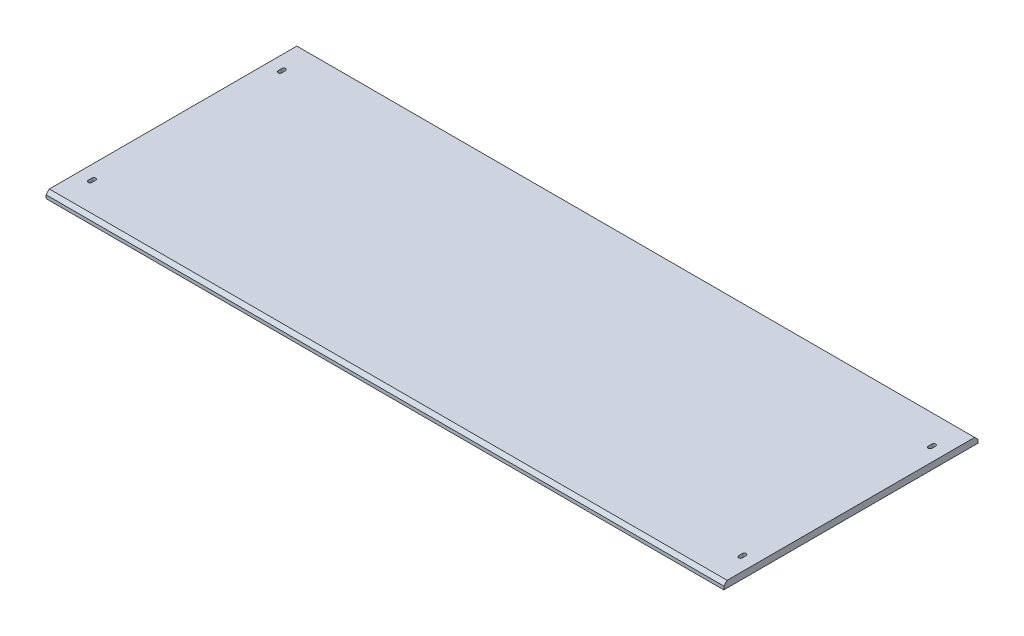
ISO-10303-21;
HEADER;
FILE_DESCRIPTION(('STEP AP214'),'2;1');
FILE_NAME('part.step','',(''),(''),'','','');
FILE_SCHEMA(('AUTOMOTIVE_DESIGN { 1 0 10303 214 1 1 1 1 }'));
ENDSEC;
DATA;
#1=APPLICATION_CONTEXT('core data for automotive mechanical design processes');
#2=APPLICATION_PROTOCOL_DEFINITION('international standard','automotive_design',2000,#1);
#3=PRODUCT_CONTEXT('',#1,'mechanical');
#4=PRODUCT('Part','Part','',(#3));
#5=PRODUCT_RELATED_PRODUCT_CATEGORY('part','',(#4));
#6=PRODUCT_DEFINITION_FORMATION('','',#4);
#7=PRODUCT_DEFINITION_CONTEXT('part definition',#1,'design');
#8=PRODUCT_DEFINITION('design','',#6,#7);
#9=PRODUCT_DEFINITION_SHAPE('','',#8);
#10=(LENGTH_UNIT() NAMED_UNIT(*) SI_UNIT(.MILLI.,.METRE.));
#11=(NAMED_UNIT(*) PLANE_ANGLE_UNIT() SI_UNIT($,.RADIAN.));
#12=(NAMED_UNIT(*) SI_UNIT($,.STERADIAN.) SOLID_ANGLE_UNIT());
#13=UNCERTAINTY_MEASURE_WITH_UNIT(LENGTH_MEASURE(1.E-05),#10,'distance_accuracy_value','');
#14=(GEOMETRIC_REPRESENTATION_CONTEXT(3) GLOBAL_UNCERTAINTY_ASSIGNED_CONTEXT((#13)) GLOBAL_UNIT_ASSIGNED_CONTEXT((#10,
#11,#12)) REPRESENTATION_CONTEXT('',''));
#15=CARTESIAN_POINT('',(0.,0.,0.));
#16=DIRECTION('',(0.,0.,1.));
#17=DIRECTION('',(1.,0.,0.));
#18=AXIS2_PLACEMENT_3D('',#15,#16,#17);
#19=CARTESIAN_POINT('',(0.,12.,222.6));
#20=DIRECTION('',(0.,-0.707106781186548,-0.707106781186548));
#21=DIRECTION('',(0.,0.707106781186548,-0.707106781186548));
#22=AXIS2_PLACEMENT_3D('',#19,#20,#21);
#23=PLANE('',#22);
#24=DIRECTION('',(-1.,0.,0.));
#25=VECTOR('',#24,1.);
#26=CARTESIAN_POINT('',(-609.6,5.99999999999999,228.6));
#27=LINE('',#26,#25);
#28=CARTESIAN_POINT('',(-609.6,5.99999999999999,228.6));
#29=VERTEX_POINT('',#28);
#30=CARTESIAN_POINT('',(609.6,5.99999999999999,228.6));
#31=VERTEX_POINT('',#30);
#32=EDGE_CURVE('E299',#29,#31,#27,.F.);
#33=ORIENTED_EDGE('',*,*,#32,.T.);
#34=DIRECTION('',(0.,0.707106781186546,-0.707106781186549));
#35=VECTOR('',#34,1.);
#36=CARTESIAN_POINT('',(609.6,5.99999999999999,228.6));
#37=LINE('',#36,#35);
#38=CARTESIAN_POINT('',(609.6,12.,222.6));
#39=VERTEX_POINT('',#38);
#40=EDGE_CURVE('E197',#31,#39,#37,.T.);
#41=ORIENTED_EDGE('',*,*,#40,.T.);
#42=DIRECTION('',(1.,0.,0.));
#43=VECTOR('',#42,1.);
#44=CARTESIAN_POINT('',(0.,12.,222.6));
#45=LINE('',#44,#43);
#46=CARTESIAN_POINT('',(-609.6,12.,222.6));
#47=VERTEX_POINT('',#46);
#48=EDGE_CURVE('E192',#39,#47,#45,.F.);
#49=ORIENTED_EDGE('',*,*,#48,.T.);
#50=DIRECTION('',(0.,-0.707106781186546,0.707106781186549));
#51=VECTOR('',#50,1.);
#52=CARTESIAN_POINT('',(-609.6,12.,222.6));
#53=LINE('',#52,#51);
#54=EDGE_CURVE('E295',#47,#29,#53,.T.);
#55=ORIENTED_EDGE('',*,*,#54,.T.);
#56=EDGE_LOOP('',(#33,#41,#49,#55));
#57=FACE_BOUND('',#56,.T.);
#58=ADVANCED_FACE('F17',(#57),#23,.F.);
#59=CARTESIAN_POINT('',(0.,12.,0.));
#60=DIRECTION('',(0.,-1.,0.));
#61=DIRECTION('',(0.,0.,-1.));
#62=AXIS2_PLACEMENT_3D('',#59,#60,#61);
#63=PLANE('',#62);
#64=DIRECTION('',(1.,0.,0.));
#65=VECTOR('',#64,1.);
#66=CARTESIAN_POINT('',(0.,12.,-222.6));
#67=LINE('',#66,#65);
#68=CARTESIAN_POINT('',(609.6,12.,-222.6));
#69=VERTEX_POINT('',#68);
#70=CARTESIAN_POINT('',(-609.6,12.,-222.6));
#71=VERTEX_POINT('',#70);
#72=EDGE_CURVE('E174',#69,#71,#67,.F.);
#73=ORIENTED_EDGE('',*,*,#72,.T.);
#74=DIRECTION('',(0.,0.,-1.));
#75=VECTOR('',#74,1.);
#76=CARTESIAN_POINT('',(-609.6,12.,228.6));
#77=LINE('',#76,#75);
#78=EDGE_CURVE('E287',#71,#47,#77,.F.);
#79=ORIENTED_EDGE('',*,*,#78,.T.);
#80=ORIENTED_EDGE('',*,*,#48,.F.);
#81=DIRECTION('',(0.,0.,1.));
#82=VECTOR('',#81,1.);
#83=CARTESIAN_POINT('',(609.6,12.,228.6));
#84=LINE('',#83,#82);
#85=EDGE_CURVE('E303',#39,#69,#84,.F.);
#86=ORIENTED_EDGE('',*,*,#85,.T.);
#87=EDGE_LOOP('',(#73,#79,#80,#86));
#88=FACE_BOUND('',#87,.T.);
#89=CARTESIAN_POINT('',(-584.835,12.,-173.99519258972));
#90=DIRECTION('',(0.,1.,0.));
#91=DIRECTION('',(0.,0.,1.));
#92=AXIS2_PLACEMENT_3D('',#89,#90,#91);
#93=CIRCLE('',#92,3.36550000000024);
#94=CARTESIAN_POINT('',(-588.200500000001,12.,-173.99519258972));
#95=VERTEX_POINT('',#94);
#96=CARTESIAN_POINT('',(-581.4695,12.,-173.99519258972));
#97=VERTEX_POINT('',#96);
#98=EDGE_CURVE('E207',#95,#97,#93,.F.);
#99=ORIENTED_EDGE('',*,*,#98,.T.);
#100=DIRECTION('',(0.,0.,-1.));
#101=VECTOR('',#100,1.);
#102=CARTESIAN_POINT('',(-581.4695,12.,-173.99519258972));
#103=LINE('',#102,#101);
#104=CARTESIAN_POINT('',(-581.4695,12.,-167.26419258972));
#105=VERTEX_POINT('',#104);
#106=EDGE_CURVE('E194',#97,#105,#103,.F.);
#107=ORIENTED_EDGE('',*,*,#106,.T.);
#108=CARTESIAN_POINT('',(-584.835,12.,-167.26419258972));
#109=DIRECTION('',(0.,1.,0.));
#110=DIRECTION('',(0.,0.,1.));
#111=AXIS2_PLACEMENT_3D('',#108,#109,#110);
#112=CIRCLE('',#111,3.36550000000024);
#113=CARTESIAN_POINT('',(-588.200500000001,12.,-167.26419258972));
#114=VERTEX_POINT('',#113);
#115=EDGE_CURVE('E253',#105,#114,#112,.F.);
#116=ORIENTED_EDGE('',*,*,#115,.T.);
#117=DIRECTION('',(0.,0.,1.));
#118=VECTOR('',#117,1.);
#119=CARTESIAN_POINT('',(-588.200500000001,12.,-173.99519258972));
#120=LINE('',#119,#118);
#121=EDGE_CURVE('E199',#114,#95,#120,.F.);
#122=ORIENTED_EDGE('',*,*,#121,.T.);
#123=EDGE_LOOP('',(#99,#107,#116,#122));
#124=FACE_BOUND('',#123,.T.);
#125=CARTESIAN_POINT('',(-584.835,12.,173.99519258972));
#126=DIRECTION('',(0.,1.,0.));
#127=DIRECTION('',(0.,0.,1.));
#128=AXIS2_PLACEMENT_3D('',#125,#126,#127);
#129=CIRCLE('',#128,3.36550000000002);
#130=CARTESIAN_POINT('',(-581.4695,12.,173.99519258972));
#131=VERTEX_POINT('',#130);
#132=CARTESIAN_POINT('',(-588.2005,12.,173.99519258972));
#133=VERTEX_POINT('',#132);
#134=EDGE_CURVE('E217',#131,#133,#129,.F.);
#135=ORIENTED_EDGE('',*,*,#134,.T.);
#136=DIRECTION('',(0.,0.,1.));
#137=VECTOR('',#136,1.);
#138=CARTESIAN_POINT('',(-588.2005,12.,173.99519258972));
#139=LINE('',#138,#137);
#140=CARTESIAN_POINT('',(-588.2005,12.,167.26419258972));
#141=VERTEX_POINT('',#140);
#142=EDGE_CURVE('E204',#133,#141,#139,.F.);
#143=ORIENTED_EDGE('',*,*,#142,.T.);
#144=CARTESIAN_POINT('',(-584.835,12.,167.26419258972));
#145=DIRECTION('',(0.,1.,0.));
#146=DIRECTION('',(0.,0.,1.));
#147=AXIS2_PLACEMENT_3D('',#144,#145,#146);
#148=CIRCLE('',#147,3.36550000000002);
#149=CARTESIAN_POINT('',(-581.4695,12.,167.26419258972));
#150=VERTEX_POINT('',#149);
#151=EDGE_CURVE('E257',#141,#150,#148,.F.);
#152=ORIENTED_EDGE('',*,*,#151,.T.);
#153=DIRECTION('',(0.,0.,-1.));
#154=VECTOR('',#153,1.);
#155=CARTESIAN_POINT('',(-581.4695,12.,173.99519258972));
#156=LINE('',#155,#154);
#157=EDGE_CURVE('E209',#150,#131,#156,.F.);
#158=ORIENTED_EDGE('',*,*,#157,.T.);
#159=EDGE_LOOP('',(#135,#143,#152,#158));
#160=FACE_BOUND('',#159,.T.);
#161=CARTESIAN_POINT('',(584.835,12.,173.99519258972));
#162=DIRECTION('',(0.,1.,0.));
#163=DIRECTION('',(0.,0.,1.));
#164=AXIS2_PLACEMENT_3D('',#161,#162,#163);
#165=CIRCLE('',#164,3.36550000000002);
#166=CARTESIAN_POINT('',(588.2005,12.,173.99519258972));
#167=VERTEX_POINT('',#166);
#168=CARTESIAN_POINT('',(581.4695,12.,173.99519258972));
#169=VERTEX_POINT('',#168);
#170=EDGE_CURVE('E225',#167,#169,#165,.F.);
#171=ORIENTED_EDGE('',*,*,#170,.T.);
#172=DIRECTION('',(0.,0.,1.));
#173=VECTOR('',#172,1.);
#174=CARTESIAN_POINT('',(581.4695,12.,173.99519258972));
#175=LINE('',#174,#173);
#176=CARTESIAN_POINT('',(581.4695,12.,167.26419258972));
#177=VERTEX_POINT('',#176);
#178=EDGE_CURVE('E214',#169,#177,#175,.F.);
#179=ORIENTED_EDGE('',*,*,#178,.T.);
#180=CARTESIAN_POINT('',(584.835,12.,167.26419258972));
#181=DIRECTION('',(0.,1.,0.));
#182=DIRECTION('',(0.,0.,1.));
#183=AXIS2_PLACEMENT_3D('',#180,#181,#182);
#184=CIRCLE('',#183,3.36550000000002);
#185=CARTESIAN_POINT('',(588.2005,12.,167.26419258972));
#186=VERTEX_POINT('',#185);
#187=EDGE_CURVE('E262',#177,#186,#184,.F.);
#188=ORIENTED_EDGE('',*,*,#187,.T.);
#189=DIRECTION('',(0.,0.,-1.));
#190=VECTOR('',#189,1.);
#191=CARTESIAN_POINT('',(588.2005,12.,173.99519258972));
#192=LINE('',#191,#190);
#193=EDGE_CURVE('E219',#186,#167,#192,.F.);
#194=ORIENTED_EDGE('',*,*,#193,.T.);
#195=EDGE_LOOP('',(#171,#179,#188,#194));
#196=FACE_BOUND('',#195,.T.);
#197=CARTESIAN_POINT('',(584.835,12.,-173.99519258972));
#198=DIRECTION('',(0.,1.,0.));
#199=DIRECTION('',(0.,0.,1.));
#200=AXIS2_PLACEMENT_3D('',#197,#198,#199);
#201=CIRCLE('',#200,3.36550000000002);
#202=CARTESIAN_POINT('',(581.4695,12.,-173.99519258972));
#203=VERTEX_POINT('',#202);
#204=CARTESIAN_POINT('',(588.2005,12.,-173.99519258972));
#205=VERTEX_POINT('',#204);
#206=EDGE_CURVE('E20',#203,#205,#201,.F.);
#207=ORIENTED_EDGE('',*,*,#206,.T.);
#208=DIRECTION('',(0.,0.,-1.));
#209=VECTOR('',#208,1.);
#210=CARTESIAN_POINT('',(588.2005,12.,-173.99519258972));
#211=LINE('',#210,#209);
#212=CARTESIAN_POINT('',(588.2005,12.,-167.26419258972));
#213=VERTEX_POINT('',#212);
#214=EDGE_CURVE('E224',#205,#213,#211,.F.);
#215=ORIENTED_EDGE('',*,*,#214,.T.);
#216=CARTESIAN_POINT('',(584.835,12.,-167.26419258972));
#217=DIRECTION('',(0.,1.,0.));
#218=DIRECTION('',(0.,0.,1.));
#219=AXIS2_PLACEMENT_3D('',#216,#217,#218);
#220=CIRCLE('',#219,3.36550000000002);
#221=CARTESIAN_POINT('',(581.4695,12.,-167.26419258972));
#222=VERTEX_POINT('',#221);
#223=EDGE_CURVE('E178',#213,#222,#220,.F.);
#224=ORIENTED_EDGE('',*,*,#223,.T.);
#225=DIRECTION('',(0.,0.,1.));
#226=VECTOR('',#225,1.);
#227=CARTESIAN_POINT('',(581.4695,12.,-173.99519258972));
#228=LINE('',#227,#226);
#229=EDGE_CURVE('E176',#222,#203,#228,.F.);
#230=ORIENTED_EDGE('',*,*,#229,.T.);
#231=EDGE_LOOP('',(#207,#215,#224,#230));
#232=FACE_BOUND('',#231,.T.);
#233=ADVANCED_FACE('F177',(#88,#124,#160,#196,#232),#63,.F.);
#234=CARTESIAN_POINT('',(0.,12.,-222.6));
#235=DIRECTION('',(0.,-0.707106781186548,0.707106781186548));
#236=DIRECTION('',(0.,-0.707106781186548,-0.707106781186548));
#237=AXIS2_PLACEMENT_3D('',#234,#235,#236);
#238=PLANE('',#237);
#239=DIRECTION('',(1.,0.,0.));
#240=VECTOR('',#239,1.);
#241=CARTESIAN_POINT('',(-609.6,6.00000000000011,-228.6));
#242=LINE('',#241,#240);
#243=CARTESIAN_POINT('',(609.6,6.00000000000011,-228.6));
#244=VERTEX_POINT('',#243);
#245=CARTESIAN_POINT('',(-609.6,6.00000000000012,-228.6));
#246=VERTEX_POINT('',#245);
#247=EDGE_CURVE('E282',#244,#246,#242,.F.);
#248=ORIENTED_EDGE('',*,*,#247,.T.);
#249=DIRECTION('',(0.,0.707106781186554,0.707106781186541));
#250=VECTOR('',#249,1.);
#251=CARTESIAN_POINT('',(-609.6,6.00000000000011,-228.6));
#252=LINE('',#251,#250);
#253=EDGE_CURVE('E290',#246,#71,#252,.T.);
#254=ORIENTED_EDGE('',*,*,#253,.T.);
#255=ORIENTED_EDGE('',*,*,#72,.F.);
#256=DIRECTION('',(0.,-0.707106781186554,-0.707106781186541));
#257=VECTOR('',#256,1.);
#258=CARTESIAN_POINT('',(609.6,12.,-222.6));
#259=LINE('',#258,#257);
#260=EDGE_CURVE('E301',#69,#244,#259,.T.);
#261=ORIENTED_EDGE('',*,*,#260,.T.);
#262=EDGE_LOOP('',(#248,#254,#255,#261));
#263=FACE_BOUND('',#262,.T.);
#264=ADVANCED_FACE('F374',(#263),#238,.F.);
#265=CARTESIAN_POINT('',(584.835,0.,-173.99519258972));
#266=DIRECTION('',(0.,1.,0.));
#267=DIRECTION('',(0.,0.,1.));
#268=AXIS2_PLACEMENT_3D('',#265,#266,#267);
#269=CYLINDRICAL_SURFACE('',#268,3.36550000000002);
#270=DIRECTION('',(0.,1.,0.));
#271=VECTOR('',#270,1.);
#272=CARTESIAN_POINT('',(581.4695,0.,-173.99519258972));
#273=LINE('',#272,#271);
#274=CARTESIAN_POINT('',(581.4695,0.,-173.99519258972));
#275=VERTEX_POINT('',#274);
#276=EDGE_CURVE('E167',#203,#275,#273,.F.);
#277=ORIENTED_EDGE('',*,*,#276,.T.);
#278=CARTESIAN_POINT('',(584.835,0.,-173.99519258972));
#279=DIRECTION('',(0.,1.,0.));
#280=DIRECTION('',(0.,0.,1.));
#281=AXIS2_PLACEMENT_3D('',#278,#279,#280);
#282=CIRCLE('',#281,3.36550000000002);
#283=CARTESIAN_POINT('',(588.2005,0.,-173.99519258972));
#284=VERTEX_POINT('',#283);
#285=EDGE_CURVE('E251',#284,#275,#282,.T.);
#286=ORIENTED_EDGE('',*,*,#285,.F.);
#287=DIRECTION('',(0.,1.,0.));
#288=VECTOR('',#287,1.);
#289=CARTESIAN_POINT('',(588.2005,0.,-173.99519258972));
#290=LINE('',#289,#288);
#291=EDGE_CURVE('E170',#284,#205,#290,.T.);
#292=ORIENTED_EDGE('',*,*,#291,.T.);
#293=ORIENTED_EDGE('',*,*,#206,.F.);
#294=EDGE_LOOP('',(#277,#286,#292,#293));
#295=FACE_BOUND('',#294,.T.);
#296=ADVANCED_FACE('F165',(#295),#269,.F.);
#297=CARTESIAN_POINT('',(581.4695,0.,-173.99519258972));
#298=DIRECTION('',(-1.,0.,0.));
#299=DIRECTION('',(0.,0.,1.));
#300=AXIS2_PLACEMENT_3D('',#297,#298,#299);
#301=PLANE('',#300);
#302=DIRECTION('',(0.,1.,0.));
#303=VECTOR('',#302,1.);
#304=CARTESIAN_POINT('',(581.4695,0.,-167.26419258972));
#305=LINE('',#304,#303);
#306=CARTESIAN_POINT('',(581.4695,0.,-167.26419258972));
#307=VERTEX_POINT('',#306);
#308=EDGE_CURVE('E181',#222,#307,#305,.F.);
#309=ORIENTED_EDGE('',*,*,#308,.T.);
#310=DIRECTION('',(0.,0.,-1.));
#311=VECTOR('',#310,1.);
#312=CARTESIAN_POINT('',(581.4695,0.,0.));
#313=LINE('',#312,#311);
#314=EDGE_CURVE('E185',#275,#307,#313,.F.);
#315=ORIENTED_EDGE('',*,*,#314,.F.);
#316=ORIENTED_EDGE('',*,*,#276,.F.);
#317=ORIENTED_EDGE('',*,*,#229,.F.);
#318=EDGE_LOOP('',(#309,#315,#316,#317));
#319=FACE_BOUND('',#318,.T.);
#320=ADVANCED_FACE('F183',(#319),#301,.F.);
#321=CARTESIAN_POINT('',(584.835,0.,-167.26419258972));
#322=DIRECTION('',(0.,1.,0.));
#323=DIRECTION('',(0.,0.,1.));
#324=AXIS2_PLACEMENT_3D('',#321,#322,#323);
#325=CYLINDRICAL_SURFACE('',#324,3.36550000000002);
#326=DIRECTION('',(0.,1.,0.));
#327=VECTOR('',#326,1.);
#328=CARTESIAN_POINT('',(588.2005,0.,-167.26419258972));
#329=LINE('',#328,#327);
#330=CARTESIAN_POINT('',(588.2005,0.,-167.26419258972));
#331=VERTEX_POINT('',#330);
#332=EDGE_CURVE('E266',#213,#331,#329,.F.);
#333=ORIENTED_EDGE('',*,*,#332,.T.);
#334=CARTESIAN_POINT('',(584.835,0.,-167.26419258972));
#335=DIRECTION('',(0.,1.,0.));
#336=DIRECTION('',(0.,0.,1.));
#337=AXIS2_PLACEMENT_3D('',#334,#335,#336);
#338=CIRCLE('',#337,3.36550000000002);
#339=EDGE_CURVE('E249',#307,#331,#338,.T.);
#340=ORIENTED_EDGE('',*,*,#339,.F.);
#341=ORIENTED_EDGE('',*,*,#308,.F.);
#342=ORIENTED_EDGE('',*,*,#223,.F.);
#343=EDGE_LOOP('',(#333,#340,#341,#342));
#344=FACE_BOUND('',#343,.T.);
#345=ADVANCED_FACE('F271',(#344),#325,.F.);
#346=CARTESIAN_POINT('',(588.2005,0.,-173.99519258972));
#347=DIRECTION('',(1.,0.,0.));
#348=DIRECTION('',(0.,0.,-1.));
#349=AXIS2_PLACEMENT_3D('',#346,#347,#348);
#350=PLANE('',#349);
#351=ORIENTED_EDGE('',*,*,#291,.F.);
#352=DIRECTION('',(0.,0.,-1.));
#353=VECTOR('',#352,1.);
#354=CARTESIAN_POINT('',(588.2005,0.,0.));
#355=LINE('',#354,#353);
#356=EDGE_CURVE('E248',#331,#284,#355,.T.);
#357=ORIENTED_EDGE('',*,*,#356,.F.);
#358=ORIENTED_EDGE('',*,*,#332,.F.);
#359=ORIENTED_EDGE('',*,*,#214,.F.);
#360=EDGE_LOOP('',(#351,#357,#358,#359));
#361=FACE_BOUND('',#360,.T.);
#362=ADVANCED_FACE('F437',(#361),#350,.F.);
#363=CARTESIAN_POINT('',(584.835,0.,173.99519258972));
#364=DIRECTION('',(0.,1.,0.));
#365=DIRECTION('',(0.,0.,1.));
#366=AXIS2_PLACEMENT_3D('',#363,#364,#365);
#367=CYLINDRICAL_SURFACE('',#366,3.36550000000002);
#368=DIRECTION('',(0.,1.,0.));
#369=VECTOR('',#368,1.);
#370=CARTESIAN_POINT('',(588.2005,0.,173.99519258972));
#371=LINE('',#370,#369);
#372=CARTESIAN_POINT('',(588.2005,0.,173.99519258972));
#373=VERTEX_POINT('',#372);
#374=EDGE_CURVE('E223',#167,#373,#371,.F.);
#375=ORIENTED_EDGE('',*,*,#374,.T.);
#376=CARTESIAN_POINT('',(584.835,0.,173.99519258972));
#377=DIRECTION('',(0.,1.,0.));
#378=DIRECTION('',(0.,0.,1.));
#379=AXIS2_PLACEMENT_3D('',#376,#377,#378);
#380=CIRCLE('',#379,3.36550000000002);
#381=CARTESIAN_POINT('',(581.4695,0.,173.99519258972));
#382=VERTEX_POINT('',#381);
#383=EDGE_CURVE('E246',#382,#373,#380,.T.);
#384=ORIENTED_EDGE('',*,*,#383,.F.);
#385=DIRECTION('',(0.,1.,0.));
#386=VECTOR('',#385,1.);
#387=CARTESIAN_POINT('',(581.4695,0.,173.99519258972));
#388=LINE('',#387,#386);
#389=EDGE_CURVE('E218',#382,#169,#388,.T.);
#390=ORIENTED_EDGE('',*,*,#389,.T.);
#391=ORIENTED_EDGE('',*,*,#170,.F.);
#392=EDGE_LOOP('',(#375,#384,#390,#391));
#393=FACE_BOUND('',#392,.T.);
#394=ADVANCED_FACE('F326',(#393),#367,.F.);
#395=CARTESIAN_POINT('',(588.2005,0.,173.99519258972));
#396=DIRECTION('',(1.,0.,0.));
#397=DIRECTION('',(0.,0.,-1.));
#398=AXIS2_PLACEMENT_3D('',#395,#396,#397);
#399=PLANE('',#398);
#400=DIRECTION('',(0.,1.,0.));
#401=VECTOR('',#400,1.);
#402=CARTESIAN_POINT('',(588.2005,0.,167.26419258972));
#403=LINE('',#402,#401);
#404=CARTESIAN_POINT('',(588.2005,0.,167.26419258972));
#405=VERTEX_POINT('',#404);
#406=EDGE_CURVE('E222',#186,#405,#403,.F.);
#407=ORIENTED_EDGE('',*,*,#406,.T.);
#408=DIRECTION('',(0.,0.,-1.));
#409=VECTOR('',#408,1.);
#410=CARTESIAN_POINT('',(588.2005,0.,0.));
#411=LINE('',#410,#409);
#412=EDGE_CURVE('E245',#373,#405,#411,.T.);
#413=ORIENTED_EDGE('',*,*,#412,.F.);
#414=ORIENTED_EDGE('',*,*,#374,.F.);
#415=ORIENTED_EDGE('',*,*,#193,.F.);
#416=EDGE_LOOP('',(#407,#413,#414,#415));
#417=FACE_BOUND('',#416,.T.);
#418=ADVANCED_FACE('F330',(#417),#399,.F.);
#419=CARTESIAN_POINT('',(584.835,0.,167.26419258972));
#420=DIRECTION('',(0.,1.,0.));
#421=DIRECTION('',(0.,0.,1.));
#422=AXIS2_PLACEMENT_3D('',#419,#420,#421);
#423=CYLINDRICAL_SURFACE('',#422,3.36550000000002);
#424=DIRECTION('',(0.,1.,0.));
#425=VECTOR('',#424,1.);
#426=CARTESIAN_POINT('',(581.4695,0.,167.26419258972));
#427=LINE('',#426,#425);
#428=CARTESIAN_POINT('',(581.4695,0.,167.26419258972));
#429=VERTEX_POINT('',#428);
#430=EDGE_CURVE('E265',#177,#429,#427,.F.);
#431=ORIENTED_EDGE('',*,*,#430,.T.);
#432=CARTESIAN_POINT('',(584.835,0.,167.26419258972));
#433=DIRECTION('',(0.,1.,0.));
#434=DIRECTION('',(0.,0.,1.));
#435=AXIS2_PLACEMENT_3D('',#432,#433,#434);
#436=CIRCLE('',#435,3.36550000000002);
#437=EDGE_CURVE('E242',#405,#429,#436,.T.);
#438=ORIENTED_EDGE('',*,*,#437,.F.);
#439=ORIENTED_EDGE('',*,*,#406,.F.);
#440=ORIENTED_EDGE('',*,*,#187,.F.);
#441=EDGE_LOOP('',(#431,#438,#439,#440));
#442=FACE_BOUND('',#441,.T.);
#443=ADVANCED_FACE('F428',(#442),#423,.F.);
#444=CARTESIAN_POINT('',(581.4695,0.,173.99519258972));
#445=DIRECTION('',(-1.,0.,0.));
#446=DIRECTION('',(0.,0.,1.));
#447=AXIS2_PLACEMENT_3D('',#444,#445,#446);
#448=PLANE('',#447);
#449=ORIENTED_EDGE('',*,*,#389,.F.);
#450=DIRECTION('',(0.,0.,-1.));
#451=VECTOR('',#450,1.);
#452=CARTESIAN_POINT('',(581.4695,0.,0.));
#453=LINE('',#452,#451);
#454=EDGE_CURVE('E241',#429,#382,#453,.F.);
#455=ORIENTED_EDGE('',*,*,#454,.F.);
#456=ORIENTED_EDGE('',*,*,#430,.F.);
#457=ORIENTED_EDGE('',*,*,#178,.F.);
#458=EDGE_LOOP('',(#449,#455,#456,#457));
#459=FACE_BOUND('',#458,.T.);
#460=ADVANCED_FACE('F424',(#459),#448,.F.);
#461=CARTESIAN_POINT('',(-584.835,0.,173.99519258972));
#462=DIRECTION('',(0.,1.,0.));
#463=DIRECTION('',(0.,0.,1.));
#464=AXIS2_PLACEMENT_3D('',#461,#462,#463);
#465=CYLINDRICAL_SURFACE('',#464,3.36550000000002);
#466=DIRECTION('',(0.,1.,0.));
#467=VECTOR('',#466,1.);
#468=CARTESIAN_POINT('',(-581.4695,0.,173.99519258972));
#469=LINE('',#468,#467);
#470=CARTESIAN_POINT('',(-581.4695,0.,173.99519258972));
#471=VERTEX_POINT('',#470);
#472=EDGE_CURVE('E213',#131,#471,#469,.F.);
#473=ORIENTED_EDGE('',*,*,#472,.T.);
#474=CARTESIAN_POINT('',(-584.835,0.,173.99519258972));
#475=DIRECTION('',(0.,1.,0.));
#476=DIRECTION('',(0.,0.,1.));
#477=AXIS2_PLACEMENT_3D('',#474,#475,#476);
#478=CIRCLE('',#477,3.36550000000002);
#479=CARTESIAN_POINT('',(-588.2005,0.,173.99519258972));
#480=VERTEX_POINT('',#479);
#481=EDGE_CURVE('E239',#480,#471,#478,.T.);
#482=ORIENTED_EDGE('',*,*,#481,.F.);
#483=DIRECTION('',(0.,1.,0.));
#484=VECTOR('',#483,1.);
#485=CARTESIAN_POINT('',(-588.2005,0.,173.99519258972));
#486=LINE('',#485,#484);
#487=EDGE_CURVE('E208',#480,#133,#486,.T.);
#488=ORIENTED_EDGE('',*,*,#487,.T.);
#489=ORIENTED_EDGE('',*,*,#134,.F.);
#490=EDGE_LOOP('',(#473,#482,#488,#489));
#491=FACE_BOUND('',#490,.T.);
#492=ADVANCED_FACE('F420',(#491),#465,.F.);
#493=CARTESIAN_POINT('',(-581.4695,0.,173.99519258972));
#494=DIRECTION('',(1.,0.,0.));
#495=DIRECTION('',(0.,0.,-1.));
#496=AXIS2_PLACEMENT_3D('',#493,#494,#495);
#497=PLANE('',#496);
#498=DIRECTION('',(0.,1.,0.));
#499=VECTOR('',#498,1.);
#500=CARTESIAN_POINT('',(-581.4695,0.,167.26419258972));
#501=LINE('',#500,#499);
#502=CARTESIAN_POINT('',(-581.4695,0.,167.26419258972));
#503=VERTEX_POINT('',#502);
#504=EDGE_CURVE('E212',#150,#503,#501,.F.);
#505=ORIENTED_EDGE('',*,*,#504,.T.);
#506=DIRECTION('',(0.,0.,-1.));
#507=VECTOR('',#506,1.);
#508=CARTESIAN_POINT('',(-581.4695,0.,0.));
#509=LINE('',#508,#507);
#510=EDGE_CURVE('E238',#471,#503,#509,.T.);
#511=ORIENTED_EDGE('',*,*,#510,.F.);
#512=ORIENTED_EDGE('',*,*,#472,.F.);
#513=ORIENTED_EDGE('',*,*,#157,.F.);
#514=EDGE_LOOP('',(#505,#511,#512,#513));
#515=FACE_BOUND('',#514,.T.);
#516=ADVANCED_FACE('F416',(#515),#497,.F.);
#517=CARTESIAN_POINT('',(-584.835,0.,167.26419258972));
#518=DIRECTION('',(0.,1.,0.));
#519=DIRECTION('',(0.,0.,1.));
#520=AXIS2_PLACEMENT_3D('',#517,#518,#519);
#521=CYLINDRICAL_SURFACE('',#520,3.36550000000002);
#522=DIRECTION('',(0.,1.,0.));
#523=VECTOR('',#522,1.);
#524=CARTESIAN_POINT('',(-588.2005,0.,167.26419258972));
#525=LINE('',#524,#523);
#526=CARTESIAN_POINT('',(-588.2005,0.,167.26419258972));
#527=VERTEX_POINT('',#526);
#528=EDGE_CURVE('E260',#141,#527,#525,.F.);
#529=ORIENTED_EDGE('',*,*,#528,.T.);
#530=CARTESIAN_POINT('',(-584.835,0.,167.26419258972));
#531=DIRECTION('',(0.,1.,0.));
#532=DIRECTION('',(0.,0.,1.));
#533=AXIS2_PLACEMENT_3D('',#530,#531,#532);
#534=CIRCLE('',#533,3.36550000000002);
#535=EDGE_CURVE('E235',#503,#527,#534,.T.);
#536=ORIENTED_EDGE('',*,*,#535,.F.);
#537=ORIENTED_EDGE('',*,*,#504,.F.);
#538=ORIENTED_EDGE('',*,*,#151,.F.);
#539=EDGE_LOOP('',(#529,#536,#537,#538));
#540=FACE_BOUND('',#539,.T.);
#541=ADVANCED_FACE('F412',(#540),#521,.F.);
#542=CARTESIAN_POINT('',(-588.2005,0.,173.99519258972));
#543=DIRECTION('',(-1.,0.,0.));
#544=DIRECTION('',(0.,0.,1.));
#545=AXIS2_PLACEMENT_3D('',#542,#543,#544);
#546=PLANE('',#545);
#547=ORIENTED_EDGE('',*,*,#487,.F.);
#548=DIRECTION('',(0.,0.,-1.));
#549=VECTOR('',#548,1.);
#550=CARTESIAN_POINT('',(-588.2005,0.,0.));
#551=LINE('',#550,#549);
#552=EDGE_CURVE('E234',#527,#480,#551,.F.);
#553=ORIENTED_EDGE('',*,*,#552,.F.);
#554=ORIENTED_EDGE('',*,*,#528,.F.);
#555=ORIENTED_EDGE('',*,*,#142,.F.);
#556=EDGE_LOOP('',(#547,#553,#554,#555));
#557=FACE_BOUND('',#556,.T.);
#558=ADVANCED_FACE('F408',(#557),#546,.F.);
#559=CARTESIAN_POINT('',(-584.835,0.,-173.99519258972));
#560=DIRECTION('',(0.,1.,0.));
#561=DIRECTION('',(0.,0.,1.));
#562=AXIS2_PLACEMENT_3D('',#559,#560,#561);
#563=CYLINDRICAL_SURFACE('',#562,3.36550000000024);
#564=DIRECTION('',(0.,1.,0.));
#565=VECTOR('',#564,1.);
#566=CARTESIAN_POINT('',(-588.200500000001,0.,-173.99519258972));
#567=LINE('',#566,#565);
#568=CARTESIAN_POINT('',(-588.200500000001,0.,-173.99519258972));
#569=VERTEX_POINT('',#568);
#570=EDGE_CURVE('E203',#95,#569,#567,.F.);
#571=ORIENTED_EDGE('',*,*,#570,.T.);
#572=CARTESIAN_POINT('',(-584.835,0.,-173.99519258972));
#573=DIRECTION('',(0.,1.,0.));
#574=DIRECTION('',(0.,0.,1.));
#575=AXIS2_PLACEMENT_3D('',#572,#573,#574);
#576=CIRCLE('',#575,3.36550000000024);
#577=CARTESIAN_POINT('',(-581.4695,0.,-173.99519258972));
#578=VERTEX_POINT('',#577);
#579=EDGE_CURVE('E231',#578,#569,#576,.T.);
#580=ORIENTED_EDGE('',*,*,#579,.F.);
#581=DIRECTION('',(0.,1.,0.));
#582=VECTOR('',#581,1.);
#583=CARTESIAN_POINT('',(-581.4695,0.,-173.99519258972));
#584=LINE('',#583,#582);
#585=EDGE_CURVE('E198',#578,#97,#584,.T.);
#586=ORIENTED_EDGE('',*,*,#585,.T.);
#587=ORIENTED_EDGE('',*,*,#98,.F.);
#588=EDGE_LOOP('',(#571,#580,#586,#587));
#589=FACE_BOUND('',#588,.T.);
#590=ADVANCED_FACE('F404',(#589),#563,.F.);
#591=CARTESIAN_POINT('',(-588.200500000001,0.,-173.99519258972));
#592=DIRECTION('',(-1.,0.,0.));
#593=DIRECTION('',(0.,0.,1.));
#594=AXIS2_PLACEMENT_3D('',#591,#592,#593);
#595=PLANE('',#594);
#596=DIRECTION('',(0.,1.,0.));
#597=VECTOR('',#596,1.);
#598=CARTESIAN_POINT('',(-588.200500000001,0.,-167.26419258972));
#599=LINE('',#598,#597);
#600=CARTESIAN_POINT('',(-588.200500000001,0.,-167.26419258972));
#601=VERTEX_POINT('',#600);
#602=EDGE_CURVE('E202',#114,#601,#599,.F.);
#603=ORIENTED_EDGE('',*,*,#602,.T.);
#604=DIRECTION('',(0.,0.,-1.));
#605=VECTOR('',#604,1.);
#606=CARTESIAN_POINT('',(-588.200500000001,0.,0.));
#607=LINE('',#606,#605);
#608=EDGE_CURVE('E230',#569,#601,#607,.F.);
#609=ORIENTED_EDGE('',*,*,#608,.F.);
#610=ORIENTED_EDGE('',*,*,#570,.F.);
#611=ORIENTED_EDGE('',*,*,#121,.F.);
#612=EDGE_LOOP('',(#603,#609,#610,#611));
#613=FACE_BOUND('',#612,.T.);
#614=ADVANCED_FACE('F400',(#613),#595,.F.);
#615=CARTESIAN_POINT('',(-584.835,0.,-167.26419258972));
#616=DIRECTION('',(0.,1.,0.));
#617=DIRECTION('',(0.,0.,1.));
#618=AXIS2_PLACEMENT_3D('',#615,#616,#617);
#619=CYLINDRICAL_SURFACE('',#618,3.36550000000024);
#620=DIRECTION('',(0.,1.,0.));
#621=VECTOR('',#620,1.);
#622=CARTESIAN_POINT('',(-581.4695,0.,-167.26419258972));
#623=LINE('',#622,#621);
#624=CARTESIAN_POINT('',(-581.4695,0.,-167.26419258972));
#625=VERTEX_POINT('',#624);
#626=EDGE_CURVE('E255',#105,#625,#623,.F.);
#627=ORIENTED_EDGE('',*,*,#626,.T.);
#628=CARTESIAN_POINT('',(-584.835,0.,-167.26419258972));
#629=DIRECTION('',(0.,1.,0.));
#630=DIRECTION('',(0.,0.,1.));
#631=AXIS2_PLACEMENT_3D('',#628,#629,#630);
#632=CIRCLE('',#631,3.36550000000024);
#633=EDGE_CURVE('E227',#601,#625,#632,.T.);
#634=ORIENTED_EDGE('',*,*,#633,.F.);
#635=ORIENTED_EDGE('',*,*,#602,.F.);
#636=ORIENTED_EDGE('',*,*,#115,.F.);
#637=EDGE_LOOP('',(#627,#634,#635,#636));
#638=FACE_BOUND('',#637,.T.);
#639=ADVANCED_FACE('F396',(#638),#619,.F.);
#640=CARTESIAN_POINT('',(-581.4695,0.,-173.99519258972));
#641=DIRECTION('',(1.,0.,0.));
#642=DIRECTION('',(0.,0.,-1.));
#643=AXIS2_PLACEMENT_3D('',#640,#641,#642);
#644=PLANE('',#643);
#645=ORIENTED_EDGE('',*,*,#585,.F.);
#646=DIRECTION('',(0.,0.,-1.));
#647=VECTOR('',#646,1.);
#648=CARTESIAN_POINT('',(-581.4695,0.,0.));
#649=LINE('',#648,#647);
#650=EDGE_CURVE('E229',#625,#578,#649,.T.);
#651=ORIENTED_EDGE('',*,*,#650,.F.);
#652=ORIENTED_EDGE('',*,*,#626,.F.);
#653=ORIENTED_EDGE('',*,*,#106,.F.);
#654=EDGE_LOOP('',(#645,#651,#652,#653));
#655=FACE_BOUND('',#654,.T.);
#656=ADVANCED_FACE('F393',(#655),#644,.F.);
#657=CARTESIAN_POINT('',(609.6,12.,228.6));
#658=DIRECTION('',(-1.,0.,0.));
#659=DIRECTION('',(0.,0.,1.));
#660=AXIS2_PLACEMENT_3D('',#657,#658,#659);
#661=PLANE('',#660);
#662=ORIENTED_EDGE('',*,*,#260,.F.);
#663=ORIENTED_EDGE('',*,*,#85,.F.);
#664=ORIENTED_EDGE('',*,*,#40,.F.);
#665=DIRECTION('',(0.,1.,0.));
#666=VECTOR('',#665,1.);
#667=CARTESIAN_POINT('',(609.6,12.,228.6));
#668=LINE('',#667,#666);
#669=CARTESIAN_POINT('',(609.6,0.,228.6));
#670=VERTEX_POINT('',#669);
#671=EDGE_CURVE('E297',#31,#670,#668,.F.);
#672=ORIENTED_EDGE('',*,*,#671,.T.);
#673=DIRECTION('',(0.,0.,-1.));
#674=VECTOR('',#673,1.);
#675=CARTESIAN_POINT('',(609.6,0.,0.));
#676=LINE('',#675,#674);
#677=CARTESIAN_POINT('',(609.6,0.,-228.6));
#678=VERTEX_POINT('',#677);
#679=EDGE_CURVE('E345',#678,#670,#676,.F.);
#680=ORIENTED_EDGE('',*,*,#679,.F.);
#681=DIRECTION('',(0.,1.,0.));
#682=VECTOR('',#681,1.);
#683=CARTESIAN_POINT('',(609.6,12.,-228.6));
#684=LINE('',#683,#682);
#685=EDGE_CURVE('E284',#678,#244,#684,.T.);
#686=ORIENTED_EDGE('',*,*,#685,.T.);
#687=EDGE_LOOP('',(#662,#663,#664,#672,#680,#686));
#688=FACE_BOUND('',#687,.T.);
#689=ADVANCED_FACE('F369',(#688),#661,.F.);
#690=CARTESIAN_POINT('',(-609.6,12.,228.6));
#691=DIRECTION('',(0.,0.,-1.));
#692=DIRECTION('',(-1.,0.,0.));
#693=AXIS2_PLACEMENT_3D('',#690,#691,#692);
#694=PLANE('',#693);
#695=ORIENTED_EDGE('',*,*,#32,.F.);
#696=DIRECTION('',(0.,1.,0.));
#697=VECTOR('',#696,1.);
#698=CARTESIAN_POINT('',(-609.6,12.,228.6));
#699=LINE('',#698,#697);
#700=CARTESIAN_POINT('',(-609.6,0.,228.6));
#701=VERTEX_POINT('',#700);
#702=EDGE_CURVE('E293',#29,#701,#699,.F.);
#703=ORIENTED_EDGE('',*,*,#702,.T.);
#704=DIRECTION('',(1.,0.,0.));
#705=VECTOR('',#704,1.);
#706=CARTESIAN_POINT('',(0.,0.,228.6));
#707=LINE('',#706,#705);
#708=EDGE_CURVE('E348',#670,#701,#707,.F.);
#709=ORIENTED_EDGE('',*,*,#708,.F.);
#710=ORIENTED_EDGE('',*,*,#671,.F.);
#711=EDGE_LOOP('',(#695,#703,#709,#710));
#712=FACE_BOUND('',#711,.T.);
#713=ADVANCED_FACE('F361',(#712),#694,.F.);
#714=CARTESIAN_POINT('',(-609.6,12.,228.6));
#715=DIRECTION('',(1.,0.,0.));
#716=DIRECTION('',(0.,0.,-1.));
#717=AXIS2_PLACEMENT_3D('',#714,#715,#716);
#718=PLANE('',#717);
#719=ORIENTED_EDGE('',*,*,#253,.F.);
#720=DIRECTION('',(0.,1.,0.));
#721=VECTOR('',#720,1.);
#722=CARTESIAN_POINT('',(-609.6,12.,-228.6));
#723=LINE('',#722,#721);
#724=CARTESIAN_POINT('',(-609.6,0.,-228.6));
#725=VERTEX_POINT('',#724);
#726=EDGE_CURVE('E35',#246,#725,#723,.F.);
#727=ORIENTED_EDGE('',*,*,#726,.T.);
#728=DIRECTION('',(0.,0.,-1.));
#729=VECTOR('',#728,1.);
#730=CARTESIAN_POINT('',(-609.6,0.,0.));
#731=LINE('',#730,#729);
#732=EDGE_CURVE('E26',#701,#725,#731,.T.);
#733=ORIENTED_EDGE('',*,*,#732,.F.);
#734=ORIENTED_EDGE('',*,*,#702,.F.);
#735=ORIENTED_EDGE('',*,*,#54,.F.);
#736=ORIENTED_EDGE('',*,*,#78,.F.);
#737=EDGE_LOOP('',(#719,#727,#733,#734,#735,#736));
#738=FACE_BOUND('',#737,.T.);
#739=ADVANCED_FACE('F356',(#738),#718,.F.);
#740=CARTESIAN_POINT('',(-609.6,12.,-228.6));
#741=DIRECTION('',(0.,0.,1.));
#742=DIRECTION('',(1.,0.,0.));
#743=AXIS2_PLACEMENT_3D('',#740,#741,#742);
#744=PLANE('',#743);
#745=ORIENTED_EDGE('',*,*,#247,.F.);
#746=ORIENTED_EDGE('',*,*,#685,.F.);
#747=DIRECTION('',(1.,0.,0.));
#748=VECTOR('',#747,1.);
#749=CARTESIAN_POINT('',(0.,0.,-228.6));
#750=LINE('',#749,#748);
#751=EDGE_CURVE('E11',#725,#678,#750,.T.);
#752=ORIENTED_EDGE('',*,*,#751,.F.);
#753=ORIENTED_EDGE('',*,*,#726,.F.);
#754=EDGE_LOOP('',(#745,#746,#752,#753));
#755=FACE_BOUND('',#754,.T.);
#756=ADVANCED_FACE('F377',(#755),#744,.F.);
#757=CARTESIAN_POINT('',(0.,0.,0.));
#758=DIRECTION('',(0.,-1.,0.));
#759=DIRECTION('',(0.,0.,-1.));
#760=AXIS2_PLACEMENT_3D('',#757,#758,#759);
#761=PLANE('',#760);
#762=ORIENTED_EDGE('',*,*,#732,.T.);
#763=ORIENTED_EDGE('',*,*,#751,.T.);
#764=ORIENTED_EDGE('',*,*,#679,.T.);
#765=ORIENTED_EDGE('',*,*,#708,.T.);
#766=EDGE_LOOP('',(#762,#763,#764,#765));
#767=FACE_BOUND('',#766,.T.);
#768=ORIENTED_EDGE('',*,*,#633,.T.);
#769=ORIENTED_EDGE('',*,*,#650,.T.);
#770=ORIENTED_EDGE('',*,*,#579,.T.);
#771=ORIENTED_EDGE('',*,*,#608,.T.);
#772=EDGE_LOOP('',(#768,#769,#770,#771));
#773=FACE_BOUND('',#772,.T.);
#774=ORIENTED_EDGE('',*,*,#535,.T.);
#775=ORIENTED_EDGE('',*,*,#552,.T.);
#776=ORIENTED_EDGE('',*,*,#481,.T.);
#777=ORIENTED_EDGE('',*,*,#510,.T.);
#778=EDGE_LOOP('',(#774,#775,#776,#777));
#779=FACE_BOUND('',#778,.T.);
#780=ORIENTED_EDGE('',*,*,#437,.T.);
#781=ORIENTED_EDGE('',*,*,#454,.T.);
#782=ORIENTED_EDGE('',*,*,#383,.T.);
#783=ORIENTED_EDGE('',*,*,#412,.T.);
#784=EDGE_LOOP('',(#780,#781,#782,#783));
#785=FACE_BOUND('',#784,.T.);
#786=ORIENTED_EDGE('',*,*,#339,.T.);
#787=ORIENTED_EDGE('',*,*,#356,.T.);
#788=ORIENTED_EDGE('',*,*,#285,.T.);
#789=ORIENTED_EDGE('',*,*,#314,.T.);
#790=EDGE_LOOP('',(#786,#787,#788,#789));
#791=FACE_BOUND('',#790,.T.);
#792=ADVANCED_FACE('F276',(#767,#773,#779,#785,#791),#761,.T.);
#793=CLOSED_SHELL('',(#58,#233,#264,#296,#320,#345,#362,#394,#418,#443,#460,#492,#516,#541,#558,
#590,#614,#639,#656,#689,#713,#739,#756,#792));
#794=MANIFOLD_SOLID_BREP('B1',#793);
#795=ADVANCED_BREP_SHAPE_REPRESENTATION('',(#18,#794),#14);
#796=SHAPE_DEFINITION_REPRESENTATION(#9,#795);
ENDSEC;
END-ISO-10303-21;
